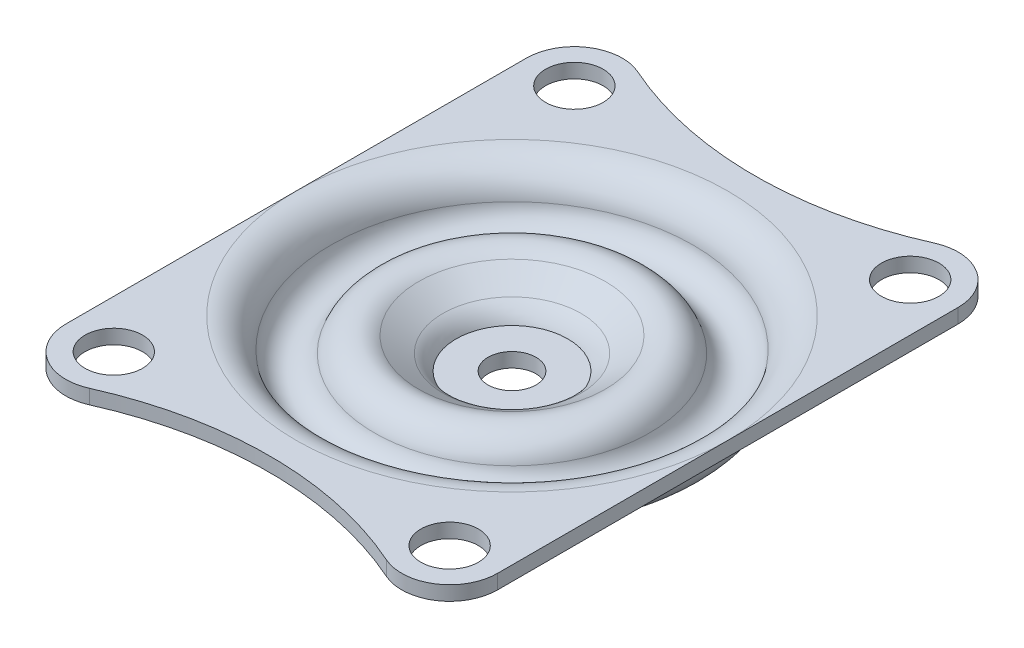
ISO-10303-21;
HEADER;
FILE_DESCRIPTION(('STEP AP214'),'2;1');
FILE_NAME('part.step','',(''),(''),'','','');
FILE_SCHEMA(('AUTOMOTIVE_DESIGN { 1 0 10303 214 1 1 1 1 }'));
ENDSEC;
DATA;
#1=APPLICATION_CONTEXT('core data for automotive mechanical design processes');
#2=APPLICATION_PROTOCOL_DEFINITION('international standard','automotive_design',2000,#1);
#3=PRODUCT_CONTEXT('',#1,'mechanical');
#4=PRODUCT('Part','Part','',(#3));
#5=PRODUCT_RELATED_PRODUCT_CATEGORY('part','',(#4));
#6=PRODUCT_DEFINITION_FORMATION('','',#4);
#7=PRODUCT_DEFINITION_CONTEXT('part definition',#1,'design');
#8=PRODUCT_DEFINITION('design','',#6,#7);
#9=PRODUCT_DEFINITION_SHAPE('','',#8);
#10=(LENGTH_UNIT() NAMED_UNIT(*) SI_UNIT(.MILLI.,.METRE.));
#11=(NAMED_UNIT(*) PLANE_ANGLE_UNIT() SI_UNIT($,.RADIAN.));
#12=(NAMED_UNIT(*) SI_UNIT($,.STERADIAN.) SOLID_ANGLE_UNIT());
#13=UNCERTAINTY_MEASURE_WITH_UNIT(LENGTH_MEASURE(1.E-05),#10,'distance_accuracy_value','');
#14=(GEOMETRIC_REPRESENTATION_CONTEXT(3) GLOBAL_UNCERTAINTY_ASSIGNED_CONTEXT((#13)) GLOBAL_UNIT_ASSIGNED_CONTEXT((#10,
#11,#12)) REPRESENTATION_CONTEXT('',''));
#15=CARTESIAN_POINT('',(0.,0.,0.));
#16=DIRECTION('',(0.,0.,1.));
#17=DIRECTION('',(1.,0.,0.));
#18=AXIS2_PLACEMENT_3D('',#15,#16,#17);
#19=CARTESIAN_POINT('',(-22.5,6.5,0.));
#20=DIRECTION('',(0.,-1.,0.));
#21=DIRECTION('',(0.,0.,-1.));
#22=AXIS2_PLACEMENT_3D('',#19,#20,#21);
#23=PLANE('',#22);
#24=CARTESIAN_POINT('',(17.5,6.5,24.));
#25=DIRECTION('',(0.,1.,0.));
#26=DIRECTION('',(0.,0.,1.));
#27=AXIS2_PLACEMENT_3D('',#24,#25,#26);
#28=CIRCLE('',#27,3.);
#29=CARTESIAN_POINT('',(17.5,6.5,27.));
#30=VERTEX_POINT('',#29);
#31=EDGE_CURVE('E208',#30,#30,#28,.T.);
#32=ORIENTED_EDGE('',*,*,#31,.F.);
#33=EDGE_LOOP('',(#32));
#34=FACE_BOUND('',#33,.T.);
#35=CARTESIAN_POINT('',(-17.5,6.5,23.9999999999998));
#36=DIRECTION('',(0.,1.,0.));
#37=DIRECTION('',(0.,0.,-1.));
#38=AXIS2_PLACEMENT_3D('',#35,#36,#37);
#39=CIRCLE('',#38,3.);
#40=CARTESIAN_POINT('',(-17.5,6.5,20.9999999999998));
#41=VERTEX_POINT('',#40);
#42=EDGE_CURVE('E189',#41,#41,#39,.T.);
#43=ORIENTED_EDGE('',*,*,#42,.F.);
#44=EDGE_LOOP('',(#43));
#45=FACE_BOUND('',#44,.T.);
#46=CARTESIAN_POINT('',(-1.11022302462516E-13,6.5,63.2973960090148));
#47=DIRECTION('',(0.,-1.,0.));
#48=DIRECTION('',(0.,0.,-1.));
#49=AXIS2_PLACEMENT_3D('',#46,#47,#48);
#50=CIRCLE('',#49,38.017849005841);
#51=CARTESIAN_POINT('',(-15.4659605949122,6.5,28.5675686856959));
#52=VERTEX_POINT('',#51);
#53=CARTESIAN_POINT('',(15.4659605949121,6.5,28.5675686856959));
#54=VERTEX_POINT('',#53);
#55=EDGE_CURVE('E168',#52,#54,#50,.T.);
#56=ORIENTED_EDGE('',*,*,#55,.T.);
#57=CARTESIAN_POINT('',(17.5,6.5,24.));
#58=DIRECTION('',(0.,1.,0.));
#59=DIRECTION('',(0.,0.,1.));
#60=AXIS2_PLACEMENT_3D('',#57,#58,#59);
#61=CIRCLE('',#60,5.00000000000003);
#62=CARTESIAN_POINT('',(22.5,6.5,24.));
#63=VERTEX_POINT('',#62);
#64=EDGE_CURVE('E162',#54,#63,#61,.T.);
#65=ORIENTED_EDGE('',*,*,#64,.T.);
#66=DIRECTION('',(0.,0.,-1.));
#67=VECTOR('',#66,1.);
#68=CARTESIAN_POINT('',(22.5,6.5,-24.));
#69=LINE('',#68,#67);
#70=CARTESIAN_POINT('',(22.5,6.5,0.));
#71=VERTEX_POINT('',#70);
#72=EDGE_CURVE('E71',#63,#71,#69,.T.);
#73=ORIENTED_EDGE('',*,*,#72,.T.);
#74=CARTESIAN_POINT('',(0.,6.5,0.));
#75=DIRECTION('',(0.,-1.,0.));
#76=DIRECTION('',(0.,0.,-1.));
#77=AXIS2_PLACEMENT_3D('',#74,#75,#76);
#78=CIRCLE('',#77,22.5);
#79=CARTESIAN_POINT('',(-22.5,6.5,0.));
#80=VERTEX_POINT('',#79);
#81=EDGE_CURVE('E229',#71,#80,#78,.T.);
#82=ORIENTED_EDGE('',*,*,#81,.T.);
#83=DIRECTION('',(0.,0.,1.));
#84=VECTOR('',#83,1.);
#85=CARTESIAN_POINT('',(-22.5,6.5,-24.));
#86=LINE('',#85,#84);
#87=CARTESIAN_POINT('',(-22.5,6.5,23.9999999999998));
#88=VERTEX_POINT('',#87);
#89=EDGE_CURVE('E178',#80,#88,#86,.T.);
#90=ORIENTED_EDGE('',*,*,#89,.T.);
#91=CARTESIAN_POINT('',(-17.5,6.5,23.9999999999998));
#92=DIRECTION('',(0.,1.,0.));
#93=DIRECTION('',(0.,0.,-1.));
#94=AXIS2_PLACEMENT_3D('',#91,#92,#93);
#95=CIRCLE('',#94,4.99999999999998);
#96=EDGE_CURVE('E182',#88,#52,#95,.T.);
#97=ORIENTED_EDGE('',*,*,#96,.T.);
#98=EDGE_LOOP('',(#56,#65,#73,#82,#90,#97));
#99=FACE_BOUND('',#98,.T.);
#100=ADVANCED_FACE('F54',(#34,#45,#99),#23,.F.);
#101=CARTESIAN_POINT('',(17.5,6.5,-24.));
#102=DIRECTION('',(0.,1.,0.));
#103=DIRECTION('',(0.,0.,-1.));
#104=AXIS2_PLACEMENT_3D('',#101,#102,#103);
#105=CIRCLE('',#104,3.);
#106=CARTESIAN_POINT('',(17.5,6.5,-27.));
#107=VERTEX_POINT('',#106);
#108=EDGE_CURVE('E209',#107,#107,#105,.T.);
#109=ORIENTED_EDGE('',*,*,#108,.F.);
#110=EDGE_LOOP('',(#109));
#111=FACE_BOUND('',#110,.T.);
#112=CARTESIAN_POINT('',(-17.5,6.5,-24.));
#113=DIRECTION('',(0.,1.,0.));
#114=DIRECTION('',(0.,0.,1.));
#115=AXIS2_PLACEMENT_3D('',#112,#113,#114);
#116=CIRCLE('',#115,3.);
#117=CARTESIAN_POINT('',(-17.5,6.5,-21.));
#118=VERTEX_POINT('',#117);
#119=EDGE_CURVE('E213',#118,#118,#116,.T.);
#120=ORIENTED_EDGE('',*,*,#119,.F.);
#121=EDGE_LOOP('',(#120));
#122=FACE_BOUND('',#121,.T.);
#123=CARTESIAN_POINT('',(-22.5,6.5,-24.));
#124=VERTEX_POINT('',#123);
#125=EDGE_CURVE('E179',#124,#80,#86,.T.);
#126=ORIENTED_EDGE('',*,*,#125,.T.);
#127=EDGE_CURVE('E159',#80,#71,#78,.T.);
#128=ORIENTED_EDGE('',*,*,#127,.T.);
#129=CARTESIAN_POINT('',(22.5,6.5,-24.));
#130=VERTEX_POINT('',#129);
#131=EDGE_CURVE('E136',#71,#130,#69,.T.);
#132=ORIENTED_EDGE('',*,*,#131,.T.);
#133=CARTESIAN_POINT('',(17.5,6.5,-24.));
#134=DIRECTION('',(0.,1.,0.));
#135=DIRECTION('',(0.,0.,-1.));
#136=AXIS2_PLACEMENT_3D('',#133,#134,#135);
#137=CIRCLE('',#136,5.);
#138=CARTESIAN_POINT('',(15.4659605949121,6.5,-28.5675686856959));
#139=VERTEX_POINT('',#138);
#140=EDGE_CURVE('E146',#130,#139,#137,.T.);
#141=ORIENTED_EDGE('',*,*,#140,.T.);
#142=CARTESIAN_POINT('',(0.,6.5,-63.2973960090148));
#143=DIRECTION('',(0.,-1.,0.));
#144=DIRECTION('',(0.,0.,1.));
#145=AXIS2_PLACEMENT_3D('',#142,#143,#144);
#146=CIRCLE('',#145,38.017849005841);
#147=CARTESIAN_POINT('',(-15.4659605949121,6.5,-28.5675686856959));
#148=VERTEX_POINT('',#147);
#149=EDGE_CURVE('E153',#139,#148,#146,.T.);
#150=ORIENTED_EDGE('',*,*,#149,.T.);
#151=CARTESIAN_POINT('',(-17.5,6.5,-24.));
#152=DIRECTION('',(0.,1.,0.));
#153=DIRECTION('',(0.,0.,1.));
#154=AXIS2_PLACEMENT_3D('',#151,#152,#153);
#155=CIRCLE('',#154,5.);
#156=EDGE_CURVE('E174',#148,#124,#155,.T.);
#157=ORIENTED_EDGE('',*,*,#156,.T.);
#158=EDGE_LOOP('',(#126,#128,#132,#141,#150,#157));
#159=FACE_BOUND('',#158,.T.);
#160=ADVANCED_FACE('F157',(#111,#122,#159),#23,.F.);
#161=CARTESIAN_POINT('',(0.,1.5,0.));
#162=DIRECTION('',(0.,-1.,0.));
#163=DIRECTION('',(0.,0.,-1.));
#164=AXIS2_PLACEMENT_3D('',#161,#162,#163);
#165=PLANE('',#164);
#166=CARTESIAN_POINT('',(0.,1.5,0.));
#167=DIRECTION('',(0.,1.,0.));
#168=DIRECTION('',(0.,0.,1.));
#169=AXIS2_PLACEMENT_3D('',#166,#167,#168);
#170=CIRCLE('',#169,2.5);
#171=CARTESIAN_POINT('',(0.,1.5,2.5));
#172=VERTEX_POINT('',#171);
#173=EDGE_CURVE('E493',#172,#172,#170,.T.);
#174=ORIENTED_EDGE('',*,*,#173,.F.);
#175=EDGE_LOOP('',(#174));
#176=FACE_BOUND('',#175,.T.);
#177=CARTESIAN_POINT('',(0.,1.5,0.));
#178=DIRECTION('',(0.,-1.,0.));
#179=DIRECTION('',(0.,0.,-1.));
#180=AXIS2_PLACEMENT_3D('',#177,#178,#179);
#181=CIRCLE('',#180,5.81863529116175);
#182=CARTESIAN_POINT('',(0.,1.5,-5.81863529116175));
#183=VERTEX_POINT('',#182);
#184=EDGE_CURVE('E249',#183,#183,#181,.T.);
#185=ORIENTED_EDGE('',*,*,#184,.F.);
#186=EDGE_LOOP('',(#185));
#187=FACE_BOUND('',#186,.T.);
#188=ADVANCED_FACE('F412',(#176,#187),#165,.F.);
#189=CARTESIAN_POINT('',(0.,0.,0.));
#190=DIRECTION('',(0.,-1.,0.));
#191=DIRECTION('',(0.,0.,-1.));
#192=AXIS2_PLACEMENT_3D('',#189,#190,#191);
#193=TOROIDAL_SURFACE('',#192,9.19,3.69);
#194=CARTESIAN_POINT('',(0.,3.10862945943142,0.));
#195=DIRECTION('',(0.,-1.,0.));
#196=DIRECTION('',(0.,0.,-1.));
#197=AXIS2_PLACEMENT_3D('',#194,#195,#196);
#198=CIRCLE('',#197,7.20190470953853);
#199=CARTESIAN_POINT('',(0.,3.10862945943142,-7.20190470953853));
#200=VERTEX_POINT('',#199);
#201=EDGE_CURVE('E245',#200,#200,#198,.T.);
#202=ORIENTED_EDGE('',*,*,#201,.F.);
#203=EDGE_LOOP('',(#202));
#204=FACE_BOUND('',#203,.T.);
#205=ORIENTED_EDGE('',*,*,#184,.T.);
#206=EDGE_LOOP('',(#205));
#207=FACE_BOUND('',#206,.T.);
#208=ADVANCED_FACE('F406',(#204,#207),#193,.T.);
#209=CARTESIAN_POINT('',(0.,3.10862945943142,0.));
#210=DIRECTION('',(0.,1.,0.));
#211=DIRECTION('',(0.,0.,1.));
#212=AXIS2_PLACEMENT_3D('',#209,#210,#211);
#213=CONICAL_SURFACE('',#212,7.20190470953853,1.00180898826681);
#214=CARTESIAN_POINT('',(0.,4.72496709395295,0.));
#215=DIRECTION('',(0.,-1.,0.));
#216=DIRECTION('',(0.,0.,-1.));
#217=AXIS2_PLACEMENT_3D('',#214,#215,#216);
#218=CIRCLE('',#217,9.72924573346652);
#219=CARTESIAN_POINT('',(0.,4.72496709395295,-9.72924573346652));
#220=VERTEX_POINT('',#219);
#221=EDGE_CURVE('E241',#220,#220,#218,.T.);
#222=ORIENTED_EDGE('',*,*,#221,.F.);
#223=EDGE_LOOP('',(#222));
#224=FACE_BOUND('',#223,.T.);
#225=ORIENTED_EDGE('',*,*,#201,.T.);
#226=EDGE_LOOP('',(#225));
#227=FACE_BOUND('',#226,.T.);
#228=ADVANCED_FACE('F400',(#224,#227),#213,.F.);
#229=CARTESIAN_POINT('',(0.,2.10723601230514,0.));
#230=DIRECTION('',(0.,-1.,0.));
#231=DIRECTION('',(0.,0.,-1.));
#232=AXIS2_PLACEMENT_3D('',#229,#230,#231);
#233=TOROIDAL_SURFACE('',#232,11.4033914954611,3.10729465101548);
#234=CARTESIAN_POINT('',(0.,3.09547949113553,0.));
#235=DIRECTION('',(0.,-1.,0.));
#236=DIRECTION('',(0.,0.,-1.));
#237=AXIS2_PLACEMENT_3D('',#234,#235,#236);
#238=CIRCLE('',#237,14.3493471765226);
#239=CARTESIAN_POINT('',(0.,3.09547949113553,-14.3493471765226));
#240=VERTEX_POINT('',#239);
#241=EDGE_CURVE('E237',#240,#240,#238,.T.);
#242=ORIENTED_EDGE('',*,*,#241,.F.);
#243=EDGE_LOOP('',(#242));
#244=FACE_BOUND('',#243,.T.);
#245=ORIENTED_EDGE('',*,*,#221,.T.);
#246=EDGE_LOOP('',(#245));
#247=FACE_BOUND('',#246,.T.);
#248=ADVANCED_FACE('F394',(#244,#247),#233,.T.);
#249=CARTESIAN_POINT('',(0.,3.83954939535423,0.));
#250=DIRECTION('',(0.,-1.,0.));
#251=DIRECTION('',(0.,0.,-1.));
#252=AXIS2_PLACEMENT_3D('',#249,#250,#251);
#253=TOROIDAL_SURFACE('',#252,16.5674209694651,2.33954939535423);
#254=CARTESIAN_POINT('',(0.,3.44329279626798,0.));
#255=DIRECTION('',(0.,-1.,0.));
#256=DIRECTION('',(0.,0.,-1.));
#257=AXIS2_PLACEMENT_3D('',#254,#255,#256);
#258=CIRCLE('',#257,18.8731685881309);
#259=CARTESIAN_POINT('',(0.,3.44329279626798,-18.8731685881309));
#260=VERTEX_POINT('',#259);
#261=EDGE_CURVE('E233',#260,#260,#258,.T.);
#262=ORIENTED_EDGE('',*,*,#261,.F.);
#263=EDGE_LOOP('',(#262));
#264=FACE_BOUND('',#263,.T.);
#265=ORIENTED_EDGE('',*,*,#241,.T.);
#266=EDGE_LOOP('',(#265));
#267=FACE_BOUND('',#266,.T.);
#268=ADVANCED_FACE('F388',(#264,#267),#253,.F.);
#269=CARTESIAN_POINT('',(0.,2.82,0.));
#270=DIRECTION('',(0.,-1.,0.));
#271=DIRECTION('',(0.,0.,-1.));
#272=AXIS2_PLACEMENT_3D('',#269,#270,#271);
#273=TOROIDAL_SURFACE('',#272,22.5,3.68);
#274=ORIENTED_EDGE('',*,*,#81,.F.);
#275=ORIENTED_EDGE('',*,*,#127,.F.);
#276=EDGE_LOOP('',(#274,#275));
#277=FACE_BOUND('',#276,.T.);
#278=ORIENTED_EDGE('',*,*,#261,.T.);
#279=EDGE_LOOP('',(#278));
#280=FACE_BOUND('',#279,.T.);
#281=ADVANCED_FACE('F384',(#277,#280),#273,.T.);
#282=CARTESIAN_POINT('',(-17.5,-3.5,-24.));
#283=DIRECTION('',(0.,1.,0.));
#284=DIRECTION('',(0.,0.,1.));
#285=AXIS2_PLACEMENT_3D('',#282,#283,#284);
#286=CYLINDRICAL_SURFACE('',#285,3.);
#287=CARTESIAN_POINT('',(-17.5,5.,-24.));
#288=DIRECTION('',(0.,-1.,0.));
#289=DIRECTION('',(0.,0.,-1.));
#290=AXIS2_PLACEMENT_3D('',#287,#288,#289);
#291=CIRCLE('',#290,3.);
#292=CARTESIAN_POINT('',(-17.5,5.,-27.));
#293=VERTEX_POINT('',#292);
#294=EDGE_CURVE('E279',#293,#293,#291,.T.);
#295=ORIENTED_EDGE('',*,*,#294,.T.);
#296=EDGE_LOOP('',(#295));
#297=FACE_BOUND('',#296,.T.);
#298=ORIENTED_EDGE('',*,*,#119,.T.);
#299=EDGE_LOOP('',(#298));
#300=FACE_BOUND('',#299,.T.);
#301=ADVANCED_FACE('F387',(#297,#300),#286,.F.);
#302=CARTESIAN_POINT('',(-17.5,-3.5,23.9999999999998));
#303=DIRECTION('',(0.,1.,0.));
#304=DIRECTION('',(0.,0.,1.));
#305=AXIS2_PLACEMENT_3D('',#302,#303,#304);
#306=CYLINDRICAL_SURFACE('',#305,3.);
#307=CARTESIAN_POINT('',(-17.5,5.,23.9999999999998));
#308=DIRECTION('',(0.,-1.,0.));
#309=DIRECTION('',(0.,0.,-1.));
#310=AXIS2_PLACEMENT_3D('',#307,#308,#309);
#311=CIRCLE('',#310,3.);
#312=CARTESIAN_POINT('',(-17.5,5.,20.9999999999998));
#313=VERTEX_POINT('',#312);
#314=EDGE_CURVE('E283',#313,#313,#311,.T.);
#315=ORIENTED_EDGE('',*,*,#314,.T.);
#316=EDGE_LOOP('',(#315));
#317=FACE_BOUND('',#316,.T.);
#318=ORIENTED_EDGE('',*,*,#42,.T.);
#319=EDGE_LOOP('',(#318));
#320=FACE_BOUND('',#319,.T.);
#321=ADVANCED_FACE('F433',(#317,#320),#306,.F.);
#322=CARTESIAN_POINT('',(-1.11022302462516E-13,-3.5,63.2973960090148));
#323=DIRECTION('',(0.,1.,0.));
#324=DIRECTION('',(0.,0.,1.));
#325=AXIS2_PLACEMENT_3D('',#322,#323,#324);
#326=CYLINDRICAL_SURFACE('',#325,38.017849005841);
#327=DIRECTION('',(0.,1.,0.));
#328=VECTOR('',#327,1.);
#329=CARTESIAN_POINT('',(15.4659605949121,-3.5,28.5675686856959));
#330=LINE('',#329,#328);
#331=CARTESIAN_POINT('',(15.4659605949121,5.,28.5675686856959));
#332=VERTEX_POINT('',#331);
#333=EDGE_CURVE('E79',#332,#54,#330,.T.);
#334=ORIENTED_EDGE('',*,*,#333,.T.);
#335=ORIENTED_EDGE('',*,*,#55,.F.);
#336=DIRECTION('',(0.,1.,0.));
#337=VECTOR('',#336,1.);
#338=CARTESIAN_POINT('',(-15.4659605949122,-3.5,28.5675686856959));
#339=LINE('',#338,#337);
#340=CARTESIAN_POINT('',(-15.4659605949122,5.,28.5675686856959));
#341=VERTEX_POINT('',#340);
#342=EDGE_CURVE('E186',#341,#52,#339,.T.);
#343=ORIENTED_EDGE('',*,*,#342,.F.);
#344=CARTESIAN_POINT('',(-1.11022302462516E-13,5.,63.2973960090148));
#345=DIRECTION('',(0.,-1.,0.));
#346=DIRECTION('',(0.,0.,-1.));
#347=AXIS2_PLACEMENT_3D('',#344,#345,#346);
#348=CIRCLE('',#347,38.017849005841);
#349=EDGE_CURVE('E14',#332,#341,#348,.F.);
#350=ORIENTED_EDGE('',*,*,#349,.F.);
#351=EDGE_LOOP('',(#334,#335,#343,#350));
#352=FACE_BOUND('',#351,.T.);
#353=ADVANCED_FACE('F435',(#352),#326,.F.);
#354=CARTESIAN_POINT('',(-17.5,-3.5,23.9999999999998));
#355=DIRECTION('',(0.,1.,0.));
#356=DIRECTION('',(0.,0.,1.));
#357=AXIS2_PLACEMENT_3D('',#354,#355,#356);
#358=CYLINDRICAL_SURFACE('',#357,4.99999999999998);
#359=ORIENTED_EDGE('',*,*,#342,.T.);
#360=ORIENTED_EDGE('',*,*,#96,.F.);
#361=DIRECTION('',(0.,1.,0.));
#362=VECTOR('',#361,1.);
#363=CARTESIAN_POINT('',(-22.5,-3.5,23.9999999999998));
#364=LINE('',#363,#362);
#365=CARTESIAN_POINT('',(-22.5,5.,23.9999999999998));
#366=VERTEX_POINT('',#365);
#367=EDGE_CURVE('E190',#366,#88,#364,.T.);
#368=ORIENTED_EDGE('',*,*,#367,.F.);
#369=CARTESIAN_POINT('',(-17.5,5.,23.9999999999998));
#370=DIRECTION('',(0.,-1.,0.));
#371=DIRECTION('',(0.,0.,-1.));
#372=AXIS2_PLACEMENT_3D('',#369,#370,#371);
#373=CIRCLE('',#372,4.99999999999998);
#374=EDGE_CURVE('E63',#341,#366,#373,.T.);
#375=ORIENTED_EDGE('',*,*,#374,.F.);
#376=EDGE_LOOP('',(#359,#360,#368,#375));
#377=FACE_BOUND('',#376,.T.);
#378=ADVANCED_FACE('F442',(#377),#358,.T.);
#379=CARTESIAN_POINT('',(-22.5,-3.5,-24.));
#380=DIRECTION('',(-1.,0.,0.));
#381=DIRECTION('',(0.,0.,1.));
#382=AXIS2_PLACEMENT_3D('',#379,#380,#381);
#383=PLANE('',#382);
#384=ORIENTED_EDGE('',*,*,#367,.T.);
#385=ORIENTED_EDGE('',*,*,#89,.F.);
#386=ORIENTED_EDGE('',*,*,#125,.F.);
#387=DIRECTION('',(0.,1.,0.));
#388=VECTOR('',#387,1.);
#389=CARTESIAN_POINT('',(-22.5,-3.5,-24.));
#390=LINE('',#389,#388);
#391=CARTESIAN_POINT('',(-22.5,5.,-24.));
#392=VERTEX_POINT('',#391);
#393=EDGE_CURVE('E193',#392,#124,#390,.T.);
#394=ORIENTED_EDGE('',*,*,#393,.F.);
#395=DIRECTION('',(0.,0.,-1.));
#396=VECTOR('',#395,1.);
#397=CARTESIAN_POINT('',(-22.5,5.,0.));
#398=LINE('',#397,#396);
#399=CARTESIAN_POINT('',(-22.5,5.,0.));
#400=VERTEX_POINT('',#399);
#401=EDGE_CURVE('E224',#400,#392,#398,.T.);
#402=ORIENTED_EDGE('',*,*,#401,.F.);
#403=EDGE_CURVE('E228',#366,#400,#398,.T.);
#404=ORIENTED_EDGE('',*,*,#403,.F.);
#405=EDGE_LOOP('',(#384,#385,#386,#394,#402,#404));
#406=FACE_BOUND('',#405,.T.);
#407=ADVANCED_FACE('F380',(#406),#383,.T.);
#408=CARTESIAN_POINT('',(-17.5,-3.5,-24.));
#409=DIRECTION('',(0.,1.,0.));
#410=DIRECTION('',(0.,0.,1.));
#411=AXIS2_PLACEMENT_3D('',#408,#409,#410);
#412=CYLINDRICAL_SURFACE('',#411,5.);
#413=ORIENTED_EDGE('',*,*,#393,.T.);
#414=ORIENTED_EDGE('',*,*,#156,.F.);
#415=DIRECTION('',(0.,1.,0.));
#416=VECTOR('',#415,1.);
#417=CARTESIAN_POINT('',(-15.4659605949121,-3.5,-28.5675686856959));
#418=LINE('',#417,#416);
#419=CARTESIAN_POINT('',(-15.4659605949121,5.,-28.5675686856959));
#420=VERTEX_POINT('',#419);
#421=EDGE_CURVE('E196',#420,#148,#418,.T.);
#422=ORIENTED_EDGE('',*,*,#421,.F.);
#423=CARTESIAN_POINT('',(-17.5,5.,-24.));
#424=DIRECTION('',(0.,-1.,0.));
#425=DIRECTION('',(0.,0.,-1.));
#426=AXIS2_PLACEMENT_3D('',#423,#424,#425);
#427=CIRCLE('',#426,5.);
#428=EDGE_CURVE('E298',#392,#420,#427,.T.);
#429=ORIENTED_EDGE('',*,*,#428,.F.);
#430=EDGE_LOOP('',(#413,#414,#422,#429));
#431=FACE_BOUND('',#430,.T.);
#432=ADVANCED_FACE('F470',(#431),#412,.T.);
#433=CARTESIAN_POINT('',(0.,-3.5,-63.2973960090148));
#434=DIRECTION('',(0.,1.,0.));
#435=DIRECTION('',(0.,0.,1.));
#436=AXIS2_PLACEMENT_3D('',#433,#434,#435);
#437=CYLINDRICAL_SURFACE('',#436,38.017849005841);
#438=ORIENTED_EDGE('',*,*,#421,.T.);
#439=ORIENTED_EDGE('',*,*,#149,.F.);
#440=DIRECTION('',(0.,1.,0.));
#441=VECTOR('',#440,1.);
#442=CARTESIAN_POINT('',(15.4659605949121,-3.5,-28.5675686856959));
#443=LINE('',#442,#441);
#444=CARTESIAN_POINT('',(15.4659605949121,5.,-28.5675686856959));
#445=VERTEX_POINT('',#444);
#446=EDGE_CURVE('E142',#445,#139,#443,.T.);
#447=ORIENTED_EDGE('',*,*,#446,.F.);
#448=CARTESIAN_POINT('',(0.,5.,-63.2973960090148));
#449=DIRECTION('',(0.,-1.,0.));
#450=DIRECTION('',(0.,0.,-1.));
#451=AXIS2_PLACEMENT_3D('',#448,#449,#450);
#452=CIRCLE('',#451,38.017849005841);
#453=EDGE_CURVE('E294',#420,#445,#452,.F.);
#454=ORIENTED_EDGE('',*,*,#453,.F.);
#455=EDGE_LOOP('',(#438,#439,#447,#454));
#456=FACE_BOUND('',#455,.T.);
#457=ADVANCED_FACE('F467',(#456),#437,.F.);
#458=CARTESIAN_POINT('',(17.5,-3.5,-24.));
#459=DIRECTION('',(0.,1.,0.));
#460=DIRECTION('',(0.,0.,1.));
#461=AXIS2_PLACEMENT_3D('',#458,#459,#460);
#462=CYLINDRICAL_SURFACE('',#461,5.);
#463=ORIENTED_EDGE('',*,*,#446,.T.);
#464=ORIENTED_EDGE('',*,*,#140,.F.);
#465=DIRECTION('',(0.,1.,0.));
#466=VECTOR('',#465,1.);
#467=CARTESIAN_POINT('',(22.5,-3.5,-24.));
#468=LINE('',#467,#466);
#469=CARTESIAN_POINT('',(22.5,5.,-24.));
#470=VERTEX_POINT('',#469);
#471=EDGE_CURVE('E132',#470,#130,#468,.T.);
#472=ORIENTED_EDGE('',*,*,#471,.F.);
#473=CARTESIAN_POINT('',(17.5,5.,-24.));
#474=DIRECTION('',(0.,-1.,0.));
#475=DIRECTION('',(0.,0.,-1.));
#476=AXIS2_PLACEMENT_3D('',#473,#474,#475);
#477=CIRCLE('',#476,5.);
#478=EDGE_CURVE('E291',#445,#470,#477,.T.);
#479=ORIENTED_EDGE('',*,*,#478,.F.);
#480=EDGE_LOOP('',(#463,#464,#472,#479));
#481=FACE_BOUND('',#480,.T.);
#482=ADVANCED_FACE('F147',(#481),#462,.T.);
#483=CARTESIAN_POINT('',(22.5,-3.5,-24.));
#484=DIRECTION('',(1.,0.,0.));
#485=DIRECTION('',(0.,0.,-1.));
#486=AXIS2_PLACEMENT_3D('',#483,#484,#485);
#487=PLANE('',#486);
#488=ORIENTED_EDGE('',*,*,#471,.T.);
#489=ORIENTED_EDGE('',*,*,#131,.F.);
#490=ORIENTED_EDGE('',*,*,#72,.F.);
#491=DIRECTION('',(0.,1.,0.));
#492=VECTOR('',#491,1.);
#493=CARTESIAN_POINT('',(22.5,-3.5,24.));
#494=LINE('',#493,#492);
#495=CARTESIAN_POINT('',(22.5,5.,24.));
#496=VERTEX_POINT('',#495);
#497=EDGE_CURVE('E143',#496,#63,#494,.T.);
#498=ORIENTED_EDGE('',*,*,#497,.F.);
#499=DIRECTION('',(0.,0.,1.));
#500=VECTOR('',#499,1.);
#501=CARTESIAN_POINT('',(22.5,5.,0.));
#502=LINE('',#501,#500);
#503=CARTESIAN_POINT('',(22.5,5.,0.));
#504=VERTEX_POINT('',#503);
#505=EDGE_CURVE('E220',#504,#496,#502,.T.);
#506=ORIENTED_EDGE('',*,*,#505,.F.);
#507=EDGE_CURVE('E138',#470,#504,#502,.T.);
#508=ORIENTED_EDGE('',*,*,#507,.F.);
#509=EDGE_LOOP('',(#488,#489,#490,#498,#506,#508));
#510=FACE_BOUND('',#509,.T.);
#511=ADVANCED_FACE('F134',(#510),#487,.T.);
#512=CARTESIAN_POINT('',(17.5,-3.5,24.));
#513=DIRECTION('',(0.,1.,0.));
#514=DIRECTION('',(0.,0.,1.));
#515=AXIS2_PLACEMENT_3D('',#512,#513,#514);
#516=CYLINDRICAL_SURFACE('',#515,5.00000000000003);
#517=ORIENTED_EDGE('',*,*,#497,.T.);
#518=ORIENTED_EDGE('',*,*,#64,.F.);
#519=ORIENTED_EDGE('',*,*,#333,.F.);
#520=CARTESIAN_POINT('',(17.5,5.,24.));
#521=DIRECTION('',(0.,-1.,0.));
#522=DIRECTION('',(0.,0.,-1.));
#523=AXIS2_PLACEMENT_3D('',#520,#521,#522);
#524=CIRCLE('',#523,5.00000000000003);
#525=EDGE_CURVE('E278',#496,#332,#524,.T.);
#526=ORIENTED_EDGE('',*,*,#525,.F.);
#527=EDGE_LOOP('',(#517,#518,#519,#526));
#528=FACE_BOUND('',#527,.T.);
#529=ADVANCED_FACE('F455',(#528),#516,.T.);
#530=CARTESIAN_POINT('',(17.5,-3.5,24.));
#531=DIRECTION('',(0.,1.,0.));
#532=DIRECTION('',(0.,0.,1.));
#533=AXIS2_PLACEMENT_3D('',#530,#531,#532);
#534=CYLINDRICAL_SURFACE('',#533,3.);
#535=CARTESIAN_POINT('',(17.5,5.,24.));
#536=DIRECTION('',(0.,-1.,0.));
#537=DIRECTION('',(0.,0.,-1.));
#538=AXIS2_PLACEMENT_3D('',#535,#536,#537);
#539=CIRCLE('',#538,3.);
#540=CARTESIAN_POINT('',(17.5,5.,21.));
#541=VERTEX_POINT('',#540);
#542=EDGE_CURVE('E287',#541,#541,#539,.T.);
#543=ORIENTED_EDGE('',*,*,#542,.T.);
#544=EDGE_LOOP('',(#543));
#545=FACE_BOUND('',#544,.T.);
#546=ORIENTED_EDGE('',*,*,#31,.T.);
#547=EDGE_LOOP('',(#546));
#548=FACE_BOUND('',#547,.T.);
#549=ADVANCED_FACE('F453',(#545,#548),#534,.F.);
#550=CARTESIAN_POINT('',(17.5,-3.5,-24.));
#551=DIRECTION('',(0.,1.,0.));
#552=DIRECTION('',(0.,0.,1.));
#553=AXIS2_PLACEMENT_3D('',#550,#551,#552);
#554=CYLINDRICAL_SURFACE('',#553,3.);
#555=CARTESIAN_POINT('',(17.5,5.,-24.));
#556=DIRECTION('',(0.,-1.,0.));
#557=DIRECTION('',(0.,0.,-1.));
#558=AXIS2_PLACEMENT_3D('',#555,#556,#557);
#559=CIRCLE('',#558,3.);
#560=CARTESIAN_POINT('',(17.5,5.,-27.));
#561=VERTEX_POINT('',#560);
#562=EDGE_CURVE('E57',#561,#561,#559,.T.);
#563=ORIENTED_EDGE('',*,*,#562,.T.);
#564=EDGE_LOOP('',(#563));
#565=FACE_BOUND('',#564,.T.);
#566=ORIENTED_EDGE('',*,*,#108,.T.);
#567=EDGE_LOOP('',(#566));
#568=FACE_BOUND('',#567,.T.);
#569=ADVANCED_FACE('F449',(#565,#568),#554,.F.);
#570=CARTESIAN_POINT('',(0.,0.,0.));
#571=DIRECTION('',(0.,-1.,0.));
#572=DIRECTION('',(0.,0.,-1.));
#573=AXIS2_PLACEMENT_3D('',#570,#571,#572);
#574=PLANE('',#573);
#575=CARTESIAN_POINT('',(0.,0.,0.));
#576=DIRECTION('',(0.,-1.,0.));
#577=DIRECTION('',(0.,0.,-1.));
#578=AXIS2_PLACEMENT_3D('',#575,#576,#577);
#579=CIRCLE('',#578,2.5);
#580=CARTESIAN_POINT('',(0.,0.,-2.5));
#581=VERTEX_POINT('',#580);
#582=EDGE_CURVE('E491',#581,#581,#579,.F.);
#583=ORIENTED_EDGE('',*,*,#582,.T.);
#584=EDGE_LOOP('',(#583));
#585=FACE_BOUND('',#584,.T.);
#586=CARTESIAN_POINT('',(0.,0.,0.));
#587=DIRECTION('',(0.,-1.,0.));
#588=DIRECTION('',(0.,0.,-1.));
#589=AXIS2_PLACEMENT_3D('',#586,#587,#588);
#590=CIRCLE('',#589,7.);
#591=CARTESIAN_POINT('',(0.,0.,-7.));
#592=VERTEX_POINT('',#591);
#593=EDGE_CURVE('E253',#592,#592,#590,.T.);
#594=ORIENTED_EDGE('',*,*,#593,.T.);
#595=EDGE_LOOP('',(#594));
#596=FACE_BOUND('',#595,.T.);
#597=ADVANCED_FACE('F452',(#585,#596),#574,.T.);
#598=CARTESIAN_POINT('',(0.,0.,0.));
#599=DIRECTION('',(0.,-1.,0.));
#600=DIRECTION('',(0.,0.,-1.));
#601=AXIS2_PLACEMENT_3D('',#598,#599,#600);
#602=TOROIDAL_SURFACE('',#601,9.19,2.19);
#603=CARTESIAN_POINT('',(0.,1.84495894746743,0.));
#604=DIRECTION('',(0.,-1.,0.));
#605=DIRECTION('',(0.,0.,-1.));
#606=AXIS2_PLACEMENT_3D('',#603,#604,#605);
#607=CIRCLE('',#606,8.01007352679929);
#608=CARTESIAN_POINT('',(0.,1.84495894746743,-8.01007352679929));
#609=VERTEX_POINT('',#608);
#610=EDGE_CURVE('E257',#609,#609,#607,.T.);
#611=ORIENTED_EDGE('',*,*,#610,.T.);
#612=EDGE_LOOP('',(#611));
#613=FACE_BOUND('',#612,.T.);
#614=ORIENTED_EDGE('',*,*,#593,.F.);
#615=EDGE_LOOP('',(#614));
#616=FACE_BOUND('',#615,.T.);
#617=ADVANCED_FACE('F504',(#613,#616),#602,.F.);
#618=CARTESIAN_POINT('',(0.,1.84495894746743,0.));
#619=DIRECTION('',(0.,1.,0.));
#620=DIRECTION('',(0.,0.,1.));
#621=AXIS2_PLACEMENT_3D('',#618,#619,#620);
#622=CONICAL_SURFACE('',#621,8.01007352679929,1.00180898826682);
#623=CARTESIAN_POINT('',(0.,3.46129658198895,0.));
#624=DIRECTION('',(0.,-1.,0.));
#625=DIRECTION('',(0.,0.,-1.));
#626=AXIS2_PLACEMENT_3D('',#623,#624,#625);
#627=CIRCLE('',#626,10.5374145507273);
#628=CARTESIAN_POINT('',(0.,3.46129658198895,-10.5374145507273));
#629=VERTEX_POINT('',#628);
#630=EDGE_CURVE('E261',#629,#629,#627,.T.);
#631=ORIENTED_EDGE('',*,*,#630,.T.);
#632=EDGE_LOOP('',(#631));
#633=FACE_BOUND('',#632,.T.);
#634=ORIENTED_EDGE('',*,*,#610,.F.);
#635=EDGE_LOOP('',(#634));
#636=FACE_BOUND('',#635,.T.);
#637=ADVANCED_FACE('F508',(#633,#636),#622,.T.);
#638=CARTESIAN_POINT('',(0.,2.10723601230514,0.));
#639=DIRECTION('',(0.,-1.,0.));
#640=DIRECTION('',(0.,0.,-1.));
#641=AXIS2_PLACEMENT_3D('',#638,#639,#640);
#642=TOROIDAL_SURFACE('',#641,11.4033914954611,1.60729465101548);
#643=CARTESIAN_POINT('',(0.,2.61841973828552,0.));
#644=DIRECTION('',(0.,-1.,0.));
#645=DIRECTION('',(0.,0.,-1.));
#646=AXIS2_PLACEMENT_3D('',#643,#644,#645);
#647=CIRCLE('',#646,12.9272311502397);
#648=CARTESIAN_POINT('',(0.,2.61841973828552,-12.9272311502397));
#649=VERTEX_POINT('',#648);
#650=EDGE_CURVE('E265',#649,#649,#647,.T.);
#651=ORIENTED_EDGE('',*,*,#650,.T.);
#652=EDGE_LOOP('',(#651));
#653=FACE_BOUND('',#652,.T.);
#654=ORIENTED_EDGE('',*,*,#630,.F.);
#655=EDGE_LOOP('',(#654));
#656=FACE_BOUND('',#655,.T.);
#657=ADVANCED_FACE('F514',(#653,#656),#642,.F.);
#658=CARTESIAN_POINT('',(0.,3.83954939535423,0.));
#659=DIRECTION('',(0.,-1.,0.));
#660=DIRECTION('',(0.,0.,-1.));
#661=AXIS2_PLACEMENT_3D('',#658,#659,#660);
#662=TOROIDAL_SURFACE('',#661,16.5674209694651,3.83954939535423);
#663=CARTESIAN_POINT('',(0.,3.18923323257179,0.));
#664=DIRECTION('',(0.,-1.,0.));
#665=DIRECTION('',(0.,0.,-1.));
#666=AXIS2_PLACEMENT_3D('',#663,#664,#665);
#667=CIRCLE('',#666,20.3514966092732);
#668=CARTESIAN_POINT('',(0.,3.18923323257179,-20.3514966092732));
#669=VERTEX_POINT('',#668);
#670=EDGE_CURVE('E269',#669,#669,#667,.T.);
#671=ORIENTED_EDGE('',*,*,#670,.T.);
#672=EDGE_LOOP('',(#671));
#673=FACE_BOUND('',#672,.T.);
#674=ORIENTED_EDGE('',*,*,#650,.F.);
#675=EDGE_LOOP('',(#674));
#676=FACE_BOUND('',#675,.T.);
#677=ADVANCED_FACE('F520',(#673,#676),#662,.T.);
#678=CARTESIAN_POINT('',(-22.5,5.,0.));
#679=DIRECTION('',(0.,-1.,0.));
#680=DIRECTION('',(0.,0.,-1.));
#681=AXIS2_PLACEMENT_3D('',#678,#679,#680);
#682=PLANE('',#681);
#683=ORIENTED_EDGE('',*,*,#542,.F.);
#684=EDGE_LOOP('',(#683));
#685=FACE_BOUND('',#684,.T.);
#686=ORIENTED_EDGE('',*,*,#314,.F.);
#687=EDGE_LOOP('',(#686));
#688=FACE_BOUND('',#687,.T.);
#689=ORIENTED_EDGE('',*,*,#525,.T.);
#690=ORIENTED_EDGE('',*,*,#349,.T.);
#691=ORIENTED_EDGE('',*,*,#374,.T.);
#692=ORIENTED_EDGE('',*,*,#403,.T.);
#693=CARTESIAN_POINT('',(0.,5.,0.));
#694=DIRECTION('',(0.,-1.,0.));
#695=DIRECTION('',(0.,0.,-1.));
#696=AXIS2_PLACEMENT_3D('',#693,#694,#695);
#697=CIRCLE('',#696,22.5);
#698=EDGE_CURVE('E274',#504,#400,#697,.T.);
#699=ORIENTED_EDGE('',*,*,#698,.F.);
#700=ORIENTED_EDGE('',*,*,#505,.T.);
#701=EDGE_LOOP('',(#689,#690,#691,#692,#699,#700));
#702=FACE_BOUND('',#701,.T.);
#703=ADVANCED_FACE('F345',(#685,#688,#702),#682,.T.);
#704=CARTESIAN_POINT('',(0.,2.82,0.));
#705=DIRECTION('',(0.,-1.,0.));
#706=DIRECTION('',(0.,0.,-1.));
#707=AXIS2_PLACEMENT_3D('',#704,#705,#706);
#708=TOROIDAL_SURFACE('',#707,22.5,2.18);
#709=ORIENTED_EDGE('',*,*,#698,.T.);
#710=EDGE_CURVE('E273',#400,#504,#697,.T.);
#711=ORIENTED_EDGE('',*,*,#710,.T.);
#712=EDGE_LOOP('',(#709,#711));
#713=FACE_BOUND('',#712,.T.);
#714=ORIENTED_EDGE('',*,*,#670,.F.);
#715=EDGE_LOOP('',(#714));
#716=FACE_BOUND('',#715,.T.);
#717=ADVANCED_FACE('F340',(#713,#716),#708,.F.);
#718=ORIENTED_EDGE('',*,*,#562,.F.);
#719=EDGE_LOOP('',(#718));
#720=FACE_BOUND('',#719,.T.);
#721=ORIENTED_EDGE('',*,*,#294,.F.);
#722=EDGE_LOOP('',(#721));
#723=FACE_BOUND('',#722,.T.);
#724=ORIENTED_EDGE('',*,*,#710,.F.);
#725=ORIENTED_EDGE('',*,*,#401,.T.);
#726=ORIENTED_EDGE('',*,*,#428,.T.);
#727=ORIENTED_EDGE('',*,*,#453,.T.);
#728=ORIENTED_EDGE('',*,*,#478,.T.);
#729=ORIENTED_EDGE('',*,*,#507,.T.);
#730=EDGE_LOOP('',(#724,#725,#726,#727,#728,#729));
#731=FACE_BOUND('',#730,.T.);
#732=ADVANCED_FACE('F482',(#720,#723,#731),#682,.T.);
#733=CARTESIAN_POINT('',(0.,-0.001000000000001,0.));
#734=DIRECTION('',(0.,1.,0.));
#735=DIRECTION('',(0.,0.,1.));
#736=AXIS2_PLACEMENT_3D('',#733,#734,#735);
#737=CYLINDRICAL_SURFACE('',#736,2.5);
#738=ORIENTED_EDGE('',*,*,#582,.F.);
#739=EDGE_LOOP('',(#738));
#740=FACE_BOUND('',#739,.T.);
#741=ORIENTED_EDGE('',*,*,#173,.T.);
#742=EDGE_LOOP('',(#741));
#743=FACE_BOUND('',#742,.T.);
#744=ADVANCED_FACE('F480',(#740,#743),#737,.F.);
#745=CLOSED_SHELL('',(#100,#160,#188,#208,#228,#248,#268,#281,#301,#321,#353,#378,#407,#432,
#457,#482,#511,#529,#549,#569,#597,#617,#637,#657,#677,#703,#717,#732,#744));
#746=MANIFOLD_SOLID_BREP('B2',#745);
#747=ADVANCED_BREP_SHAPE_REPRESENTATION('',(#18,#746),#14);
#748=SHAPE_DEFINITION_REPRESENTATION(#9,#747);
ENDSEC;
END-ISO-10303-21;
